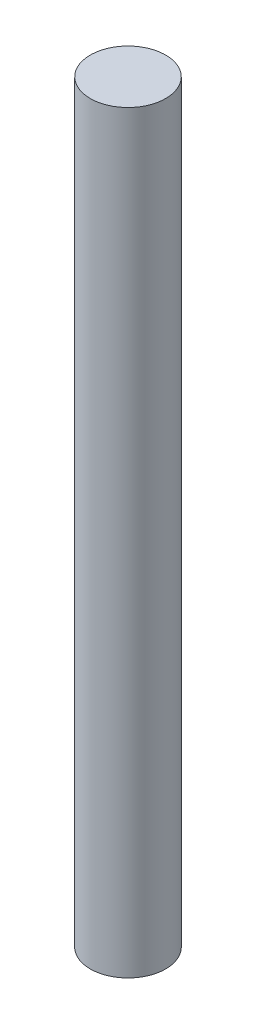
ISO-10303-21;
HEADER;
FILE_DESCRIPTION(('STEP AP214'),'2;1');
FILE_NAME('part.step','',(''),(''),'','','');
FILE_SCHEMA(('AUTOMOTIVE_DESIGN { 1 0 10303 214 1 1 1 1 }'));
ENDSEC;
DATA;
#1=APPLICATION_CONTEXT('core data for automotive mechanical design processes');
#2=APPLICATION_PROTOCOL_DEFINITION('international standard','automotive_design',2000,#1);
#3=PRODUCT_CONTEXT('',#1,'mechanical');
#4=PRODUCT('Part','Part','',(#3));
#5=PRODUCT_RELATED_PRODUCT_CATEGORY('part','',(#4));
#6=PRODUCT_DEFINITION_FORMATION('','',#4);
#7=PRODUCT_DEFINITION_CONTEXT('part definition',#1,'design');
#8=PRODUCT_DEFINITION('design','',#6,#7);
#9=PRODUCT_DEFINITION_SHAPE('','',#8);
#10=(LENGTH_UNIT() NAMED_UNIT(*) SI_UNIT(.MILLI.,.METRE.));
#11=(NAMED_UNIT(*) PLANE_ANGLE_UNIT() SI_UNIT($,.RADIAN.));
#12=(NAMED_UNIT(*) SI_UNIT($,.STERADIAN.) SOLID_ANGLE_UNIT());
#13=UNCERTAINTY_MEASURE_WITH_UNIT(LENGTH_MEASURE(1.E-05),#10,'distance_accuracy_value','');
#14=(GEOMETRIC_REPRESENTATION_CONTEXT(3) GLOBAL_UNCERTAINTY_ASSIGNED_CONTEXT((#13)) GLOBAL_UNIT_ASSIGNED_CONTEXT((#10,
#11,#12)) REPRESENTATION_CONTEXT('',''));
#15=CARTESIAN_POINT('',(0.,0.,0.));
#16=DIRECTION('',(0.,0.,1.));
#17=DIRECTION('',(1.,0.,0.));
#18=AXIS2_PLACEMENT_3D('',#15,#16,#17);
#19=CARTESIAN_POINT('',(0.,200.,0.));
#20=DIRECTION('',(0.,-1.,0.));
#21=DIRECTION('',(0.,0.,-1.));
#22=AXIS2_PLACEMENT_3D('',#19,#20,#21);
#23=CYLINDRICAL_SURFACE('',#22,10.);
#24=CARTESIAN_POINT('',(0.,200.,0.));
#25=DIRECTION('',(0.,1.,0.));
#26=DIRECTION('',(0.,0.,1.));
#27=AXIS2_PLACEMENT_3D('',#24,#25,#26);
#28=CIRCLE('',#27,10.);
#29=CARTESIAN_POINT('',(0.,200.,10.));
#30=VERTEX_POINT('',#29);
#31=EDGE_CURVE('E10',#30,#30,#28,.T.);
#32=ORIENTED_EDGE('',*,*,#31,.F.);
#33=EDGE_LOOP('',(#32));
#34=FACE_BOUND('',#33,.T.);
#35=CARTESIAN_POINT('',(0.,0.,0.));
#36=DIRECTION('',(0.,1.,0.));
#37=DIRECTION('',(0.,0.,1.));
#38=AXIS2_PLACEMENT_3D('',#35,#36,#37);
#39=CIRCLE('',#38,10.);
#40=CARTESIAN_POINT('',(0.,0.,10.));
#41=VERTEX_POINT('',#40);
#42=EDGE_CURVE('E40',#41,#41,#39,.T.);
#43=ORIENTED_EDGE('',*,*,#42,.T.);
#44=EDGE_LOOP('',(#43));
#45=FACE_BOUND('',#44,.T.);
#46=ADVANCED_FACE('F37',(#34,#45),#23,.T.);
#47=CARTESIAN_POINT('',(0.,200.,0.));
#48=DIRECTION('',(0.,1.,0.));
#49=DIRECTION('',(0.,0.,1.));
#50=AXIS2_PLACEMENT_3D('',#47,#48,#49);
#51=PLANE('',#50);
#52=ORIENTED_EDGE('',*,*,#31,.T.);
#53=EDGE_LOOP('',(#52));
#54=FACE_BOUND('',#53,.T.);
#55=ADVANCED_FACE('F54',(#54),#51,.T.);
#56=CARTESIAN_POINT('',(0.,0.,0.));
#57=DIRECTION('',(0.,1.,0.));
#58=DIRECTION('',(0.,0.,1.));
#59=AXIS2_PLACEMENT_3D('',#56,#57,#58);
#60=PLANE('',#59);
#61=ORIENTED_EDGE('',*,*,#42,.F.);
#62=EDGE_LOOP('',(#61));
#63=FACE_BOUND('',#62,.T.);
#64=ADVANCED_FACE('F52',(#63),#60,.F.);
#65=CLOSED_SHELL('',(#46,#55,#64));
#66=MANIFOLD_SOLID_BREP('B2',#65);
#67=ADVANCED_BREP_SHAPE_REPRESENTATION('',(#18,#66),#14);
#68=SHAPE_DEFINITION_REPRESENTATION(#9,#67);
ENDSEC;
END-ISO-10303-21;
